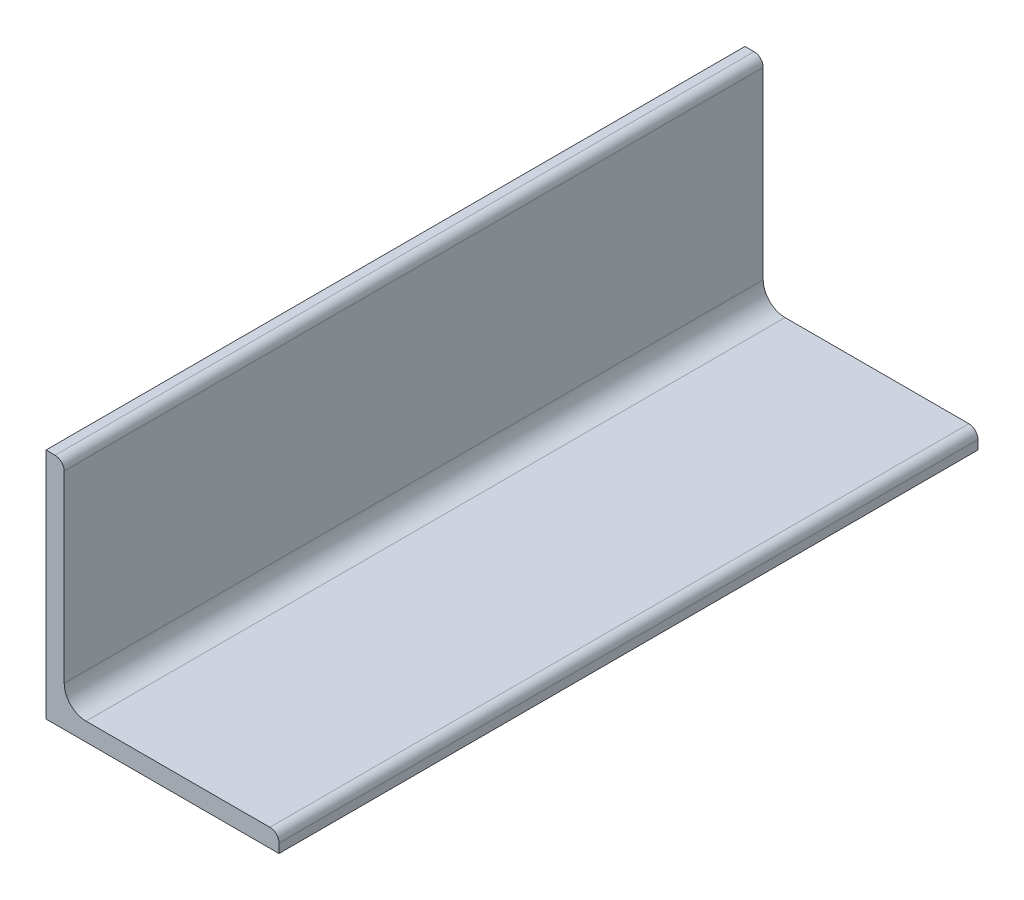
ISO-10303-21;
HEADER;
FILE_DESCRIPTION(('STEP AP214'),'2;1');
FILE_NAME('part.step','',(''),(''),'','','');
FILE_SCHEMA(('AUTOMOTIVE_DESIGN { 1 0 10303 214 1 1 1 1 }'));
ENDSEC;
DATA;
#1=APPLICATION_CONTEXT('core data for automotive mechanical design processes');
#2=APPLICATION_PROTOCOL_DEFINITION('international standard','automotive_design',2000,#1);
#3=PRODUCT_CONTEXT('',#1,'mechanical');
#4=PRODUCT('Part','Part','',(#3));
#5=PRODUCT_RELATED_PRODUCT_CATEGORY('part','',(#4));
#6=PRODUCT_DEFINITION_FORMATION('','',#4);
#7=PRODUCT_DEFINITION_CONTEXT('part definition',#1,'design');
#8=PRODUCT_DEFINITION('design','',#6,#7);
#9=PRODUCT_DEFINITION_SHAPE('','',#8);
#10=(LENGTH_UNIT() NAMED_UNIT(*) SI_UNIT(.MILLI.,.METRE.));
#11=(NAMED_UNIT(*) PLANE_ANGLE_UNIT() SI_UNIT($,.RADIAN.));
#12=(NAMED_UNIT(*) SI_UNIT($,.STERADIAN.) SOLID_ANGLE_UNIT());
#13=UNCERTAINTY_MEASURE_WITH_UNIT(LENGTH_MEASURE(1.E-05),#10,'distance_accuracy_value','');
#14=(GEOMETRIC_REPRESENTATION_CONTEXT(3) GLOBAL_UNCERTAINTY_ASSIGNED_CONTEXT((#13)) GLOBAL_UNIT_ASSIGNED_CONTEXT((#10,
#11,#12)) REPRESENTATION_CONTEXT('',''));
#15=CARTESIAN_POINT('',(0.,0.,0.));
#16=DIRECTION('',(0.,0.,1.));
#17=DIRECTION('',(1.,0.,0.));
#18=AXIS2_PLACEMENT_3D('',#15,#16,#17);
#19=CARTESIAN_POINT('',(0.865045893659089,102.172018782971,304.8));
#20=DIRECTION('',(1.,0.,0.));
#21=DIRECTION('',(0.,0.,-1.));
#22=AXIS2_PLACEMENT_3D('',#19,#20,#21);
#23=PLANE('',#22);
#24=DIRECTION('',(0.,-1.,0.));
#25=VECTOR('',#24,1.);
#26=CARTESIAN_POINT('',(0.865045893659089,102.172018782971,0.));
#27=LINE('',#26,#25);
#28=CARTESIAN_POINT('',(0.865045893659089,102.172018782971,0.));
#29=VERTEX_POINT('',#28);
#30=CARTESIAN_POINT('',(0.865045893659089,0.572018782971054,0.));
#31=VERTEX_POINT('',#30);
#32=EDGE_CURVE('E135',#29,#31,#27,.T.);
#33=ORIENTED_EDGE('',*,*,#32,.T.);
#34=DIRECTION('',(0.,0.,-1.));
#35=VECTOR('',#34,1.);
#36=CARTESIAN_POINT('',(0.865045893659089,0.572018782971054,304.8));
#37=LINE('',#36,#35);
#38=CARTESIAN_POINT('',(0.865045893659089,0.572018782971054,304.8));
#39=VERTEX_POINT('',#38);
#40=EDGE_CURVE('E11',#39,#31,#37,.T.);
#41=ORIENTED_EDGE('',*,*,#40,.F.);
#42=DIRECTION('',(0.,-1.,0.));
#43=VECTOR('',#42,1.);
#44=CARTESIAN_POINT('',(0.865045893659089,102.172018782971,304.8));
#45=LINE('',#44,#43);
#46=CARTESIAN_POINT('',(0.865045893659089,102.172018782971,304.8));
#47=VERTEX_POINT('',#46);
#48=EDGE_CURVE('E151',#47,#39,#45,.T.);
#49=ORIENTED_EDGE('',*,*,#48,.F.);
#50=DIRECTION('',(0.,0.,-1.));
#51=VECTOR('',#50,1.);
#52=CARTESIAN_POINT('',(0.865045893659089,102.172018782971,304.8));
#53=LINE('',#52,#51);
#54=EDGE_CURVE('E131',#47,#29,#53,.T.);
#55=ORIENTED_EDGE('',*,*,#54,.T.);
#56=EDGE_LOOP('',(#33,#41,#49,#55));
#57=FACE_BOUND('',#56,.T.);
#58=ADVANCED_FACE('F33',(#57),#23,.F.);
#59=CARTESIAN_POINT('',(0.865045893659089,0.572018782971054,304.8));
#60=DIRECTION('',(0.,1.,0.));
#61=DIRECTION('',(0.,0.,1.));
#62=AXIS2_PLACEMENT_3D('',#59,#60,#61);
#63=PLANE('',#62);
#64=DIRECTION('',(1.,0.,0.));
#65=VECTOR('',#64,1.);
#66=CARTESIAN_POINT('',(0.865045893659089,0.572018782971054,0.));
#67=LINE('',#66,#65);
#68=CARTESIAN_POINT('',(102.465045893659,0.572018782971054,0.));
#69=VERTEX_POINT('',#68);
#70=EDGE_CURVE('E138',#31,#69,#67,.T.);
#71=ORIENTED_EDGE('',*,*,#70,.T.);
#72=DIRECTION('',(0.,0.,-1.));
#73=VECTOR('',#72,1.);
#74=CARTESIAN_POINT('',(102.465045893659,0.572018782971054,304.8));
#75=LINE('',#74,#73);
#76=CARTESIAN_POINT('',(102.465045893659,0.572018782971054,304.8));
#77=VERTEX_POINT('',#76);
#78=EDGE_CURVE('E41',#77,#69,#75,.T.);
#79=ORIENTED_EDGE('',*,*,#78,.F.);
#80=DIRECTION('',(1.,0.,0.));
#81=VECTOR('',#80,1.);
#82=CARTESIAN_POINT('',(0.865045893659089,0.572018782971054,304.8));
#83=LINE('',#82,#81);
#84=EDGE_CURVE('E95',#39,#77,#83,.T.);
#85=ORIENTED_EDGE('',*,*,#84,.F.);
#86=ORIENTED_EDGE('',*,*,#40,.T.);
#87=EDGE_LOOP('',(#71,#79,#85,#86));
#88=FACE_BOUND('',#87,.T.);
#89=ADVANCED_FACE('F194',(#88),#63,.F.);
#90=CARTESIAN_POINT('',(102.465045893659,0.572018782971054,304.8));
#91=DIRECTION('',(-1.,0.,0.));
#92=DIRECTION('',(0.,0.,1.));
#93=AXIS2_PLACEMENT_3D('',#90,#91,#92);
#94=PLANE('',#93);
#95=DIRECTION('',(0.,1.,0.));
#96=VECTOR('',#95,1.);
#97=CARTESIAN_POINT('',(102.465045893659,0.572018782971054,0.));
#98=LINE('',#97,#96);
#99=CARTESIAN_POINT('',(102.465045893659,4.54076878297105,0.));
#100=VERTEX_POINT('',#99);
#101=EDGE_CURVE('E140',#69,#100,#98,.T.);
#102=ORIENTED_EDGE('',*,*,#101,.T.);
#103=DIRECTION('',(0.,0.,-1.));
#104=VECTOR('',#103,1.);
#105=CARTESIAN_POINT('',(102.465045893659,4.54076878297105,304.8));
#106=LINE('',#105,#104);
#107=CARTESIAN_POINT('',(102.465045893659,4.54076878297105,304.8));
#108=VERTEX_POINT('',#107);
#109=EDGE_CURVE('E161',#108,#100,#106,.T.);
#110=ORIENTED_EDGE('',*,*,#109,.F.);
#111=DIRECTION('',(0.,1.,0.));
#112=VECTOR('',#111,1.);
#113=CARTESIAN_POINT('',(102.465045893659,0.572018782971054,304.8));
#114=LINE('',#113,#112);
#115=EDGE_CURVE('E169',#77,#108,#114,.T.);
#116=ORIENTED_EDGE('',*,*,#115,.F.);
#117=ORIENTED_EDGE('',*,*,#78,.T.);
#118=EDGE_LOOP('',(#102,#110,#116,#117));
#119=FACE_BOUND('',#118,.T.);
#120=ADVANCED_FACE('F167',(#119),#94,.F.);
#121=CARTESIAN_POINT('',(98.4962958936591,4.54076878297105,304.8));
#122=DIRECTION('',(0.,0.,-1.));
#123=DIRECTION('',(-1.,0.,0.));
#124=AXIS2_PLACEMENT_3D('',#121,#122,#123);
#125=CYLINDRICAL_SURFACE('',#124,3.96875);
#126=CARTESIAN_POINT('',(98.4962958936591,4.54076878297105,0.));
#127=DIRECTION('',(0.,0.,1.));
#128=DIRECTION('',(1.,0.,0.));
#129=AXIS2_PLACEMENT_3D('',#126,#127,#128);
#130=CIRCLE('',#129,3.96875);
#131=CARTESIAN_POINT('',(98.4962958936591,8.50951878297106,0.));
#132=VERTEX_POINT('',#131);
#133=EDGE_CURVE('E142',#100,#132,#130,.T.);
#134=ORIENTED_EDGE('',*,*,#133,.T.);
#135=DIRECTION('',(0.,0.,-1.));
#136=VECTOR('',#135,1.);
#137=CARTESIAN_POINT('',(98.4962958936591,8.50951878297106,304.8));
#138=LINE('',#137,#136);
#139=CARTESIAN_POINT('',(98.4962958936591,8.50951878297106,304.8));
#140=VERTEX_POINT('',#139);
#141=EDGE_CURVE('E158',#140,#132,#138,.T.);
#142=ORIENTED_EDGE('',*,*,#141,.F.);
#143=CARTESIAN_POINT('',(98.4962958936591,4.54076878297105,304.8));
#144=DIRECTION('',(0.,0.,1.));
#145=DIRECTION('',(1.,0.,0.));
#146=AXIS2_PLACEMENT_3D('',#143,#144,#145);
#147=CIRCLE('',#146,3.96875);
#148=EDGE_CURVE('E185',#108,#140,#147,.T.);
#149=ORIENTED_EDGE('',*,*,#148,.F.);
#150=ORIENTED_EDGE('',*,*,#109,.T.);
#151=EDGE_LOOP('',(#134,#142,#149,#150));
#152=FACE_BOUND('',#151,.T.);
#153=ADVANCED_FACE('F178',(#152),#125,.T.);
#154=CARTESIAN_POINT('',(98.4962958936591,8.50951878297105,304.8));
#155=DIRECTION('',(0.,-1.,0.));
#156=DIRECTION('',(0.,0.,-1.));
#157=AXIS2_PLACEMENT_3D('',#154,#155,#156);
#158=PLANE('',#157);
#159=DIRECTION('',(-1.,0.,0.));
#160=VECTOR('',#159,1.);
#161=CARTESIAN_POINT('',(98.4962958936591,8.50951878297105,0.));
#162=LINE('',#161,#160);
#163=CARTESIAN_POINT('',(18.3275458936591,8.50951878297105,0.));
#164=VERTEX_POINT('',#163);
#165=EDGE_CURVE('E144',#132,#164,#162,.T.);
#166=ORIENTED_EDGE('',*,*,#165,.T.);
#167=DIRECTION('',(0.,0.,-1.));
#168=VECTOR('',#167,1.);
#169=CARTESIAN_POINT('',(18.3275458936591,8.50951878297105,304.8));
#170=LINE('',#169,#168);
#171=CARTESIAN_POINT('',(18.3275458936591,8.50951878297105,304.8));
#172=VERTEX_POINT('',#171);
#173=EDGE_CURVE('E155',#172,#164,#170,.T.);
#174=ORIENTED_EDGE('',*,*,#173,.F.);
#175=DIRECTION('',(-1.,0.,0.));
#176=VECTOR('',#175,1.);
#177=CARTESIAN_POINT('',(98.4962958936591,8.50951878297105,304.8));
#178=LINE('',#177,#176);
#179=EDGE_CURVE('E184',#140,#172,#178,.T.);
#180=ORIENTED_EDGE('',*,*,#179,.F.);
#181=ORIENTED_EDGE('',*,*,#141,.T.);
#182=EDGE_LOOP('',(#166,#174,#180,#181));
#183=FACE_BOUND('',#182,.T.);
#184=ADVANCED_FACE('F182',(#183),#158,.F.);
#185=CARTESIAN_POINT('',(18.3275458936591,18.034518782971,304.8));
#186=DIRECTION('',(0.,0.,-1.));
#187=DIRECTION('',(-1.,0.,0.));
#188=AXIS2_PLACEMENT_3D('',#185,#186,#187);
#189=CYLINDRICAL_SURFACE('',#188,9.52499999999999);
#190=CARTESIAN_POINT('',(18.3275458936591,18.034518782971,0.));
#191=DIRECTION('',(0.,0.,-1.));
#192=DIRECTION('',(1.,0.,0.));
#193=AXIS2_PLACEMENT_3D('',#190,#191,#192);
#194=CIRCLE('',#193,9.52499999999999);
#195=CARTESIAN_POINT('',(8.80254589365909,18.0345187829711,0.));
#196=VERTEX_POINT('',#195);
#197=EDGE_CURVE('E146',#164,#196,#194,.T.);
#198=ORIENTED_EDGE('',*,*,#197,.T.);
#199=DIRECTION('',(0.,0.,-1.));
#200=VECTOR('',#199,1.);
#201=CARTESIAN_POINT('',(8.80254589365909,18.0345187829711,304.8));
#202=LINE('',#201,#200);
#203=CARTESIAN_POINT('',(8.80254589365909,18.0345187829711,304.8));
#204=VERTEX_POINT('',#203);
#205=EDGE_CURVE('E126',#204,#196,#202,.T.);
#206=ORIENTED_EDGE('',*,*,#205,.F.);
#207=CARTESIAN_POINT('',(18.3275458936591,18.034518782971,304.8));
#208=DIRECTION('',(0.,0.,-1.));
#209=DIRECTION('',(1.,0.,0.));
#210=AXIS2_PLACEMENT_3D('',#207,#208,#209);
#211=CIRCLE('',#210,9.52499999999999);
#212=EDGE_CURVE('E117',#172,#204,#211,.T.);
#213=ORIENTED_EDGE('',*,*,#212,.F.);
#214=ORIENTED_EDGE('',*,*,#173,.T.);
#215=EDGE_LOOP('',(#198,#206,#213,#214));
#216=FACE_BOUND('',#215,.T.);
#217=ADVANCED_FACE('F206',(#216),#189,.F.);
#218=CARTESIAN_POINT('',(8.80254589365909,18.0345187829711,304.8));
#219=DIRECTION('',(-1.,0.,0.));
#220=DIRECTION('',(0.,0.,1.));
#221=AXIS2_PLACEMENT_3D('',#218,#219,#220);
#222=PLANE('',#221);
#223=DIRECTION('',(0.,1.,0.));
#224=VECTOR('',#223,1.);
#225=CARTESIAN_POINT('',(8.80254589365909,18.0345187829711,0.));
#226=LINE('',#225,#224);
#227=CARTESIAN_POINT('',(8.80254589365909,98.2032687829711,0.));
#228=VERTEX_POINT('',#227);
#229=EDGE_CURVE('E125',#196,#228,#226,.T.);
#230=ORIENTED_EDGE('',*,*,#229,.T.);
#231=DIRECTION('',(0.,0.,-1.));
#232=VECTOR('',#231,1.);
#233=CARTESIAN_POINT('',(8.80254589365909,98.2032687829711,304.8));
#234=LINE('',#233,#232);
#235=CARTESIAN_POINT('',(8.80254589365909,98.2032687829711,304.8));
#236=VERTEX_POINT('',#235);
#237=EDGE_CURVE('E122',#236,#228,#234,.T.);
#238=ORIENTED_EDGE('',*,*,#237,.F.);
#239=DIRECTION('',(0.,1.,0.));
#240=VECTOR('',#239,1.);
#241=CARTESIAN_POINT('',(8.80254589365909,18.0345187829711,304.8));
#242=LINE('',#241,#240);
#243=EDGE_CURVE('E111',#204,#236,#242,.T.);
#244=ORIENTED_EDGE('',*,*,#243,.F.);
#245=ORIENTED_EDGE('',*,*,#205,.T.);
#246=EDGE_LOOP('',(#230,#238,#244,#245));
#247=FACE_BOUND('',#246,.T.);
#248=ADVANCED_FACE('F123',(#247),#222,.F.);
#249=CARTESIAN_POINT('',(4.83379589365909,98.203268782971,304.8));
#250=DIRECTION('',(0.,0.,-1.));
#251=DIRECTION('',(-1.,0.,0.));
#252=AXIS2_PLACEMENT_3D('',#249,#250,#251);
#253=CYLINDRICAL_SURFACE('',#252,3.96875);
#254=CARTESIAN_POINT('',(4.83379589365909,98.203268782971,0.));
#255=DIRECTION('',(0.,0.,1.));
#256=DIRECTION('',(1.,0.,0.));
#257=AXIS2_PLACEMENT_3D('',#254,#255,#256);
#258=CIRCLE('',#257,3.96875);
#259=CARTESIAN_POINT('',(4.83379589365909,102.172018782971,0.));
#260=VERTEX_POINT('',#259);
#261=EDGE_CURVE('E81',#228,#260,#258,.T.);
#262=ORIENTED_EDGE('',*,*,#261,.T.);
#263=DIRECTION('',(0.,0.,-1.));
#264=VECTOR('',#263,1.);
#265=CARTESIAN_POINT('',(4.83379589365909,102.172018782971,304.8));
#266=LINE('',#265,#264);
#267=CARTESIAN_POINT('',(4.83379589365909,102.172018782971,304.8));
#268=VERTEX_POINT('',#267);
#269=EDGE_CURVE('E127',#268,#260,#266,.T.);
#270=ORIENTED_EDGE('',*,*,#269,.F.);
#271=CARTESIAN_POINT('',(4.83379589365909,98.203268782971,304.8));
#272=DIRECTION('',(0.,0.,1.));
#273=DIRECTION('',(1.,0.,0.));
#274=AXIS2_PLACEMENT_3D('',#271,#272,#273);
#275=CIRCLE('',#274,3.96875);
#276=EDGE_CURVE('E115',#236,#268,#275,.T.);
#277=ORIENTED_EDGE('',*,*,#276,.F.);
#278=ORIENTED_EDGE('',*,*,#237,.T.);
#279=EDGE_LOOP('',(#262,#270,#277,#278));
#280=FACE_BOUND('',#279,.T.);
#281=ADVANCED_FACE('F129',(#280),#253,.T.);
#282=CARTESIAN_POINT('',(4.83379589365909,102.172018782971,304.8));
#283=DIRECTION('',(0.,-1.,0.));
#284=DIRECTION('',(0.,0.,-1.));
#285=AXIS2_PLACEMENT_3D('',#282,#283,#284);
#286=PLANE('',#285);
#287=DIRECTION('',(-1.,0.,0.));
#288=VECTOR('',#287,1.);
#289=CARTESIAN_POINT('',(4.83379589365909,102.172018782971,0.));
#290=LINE('',#289,#288);
#291=EDGE_CURVE('E87',#260,#29,#290,.T.);
#292=ORIENTED_EDGE('',*,*,#291,.T.);
#293=ORIENTED_EDGE('',*,*,#54,.F.);
#294=DIRECTION('',(-1.,0.,0.));
#295=VECTOR('',#294,1.);
#296=CARTESIAN_POINT('',(4.83379589365909,102.172018782971,304.8));
#297=LINE('',#296,#295);
#298=EDGE_CURVE('E49',#268,#47,#297,.T.);
#299=ORIENTED_EDGE('',*,*,#298,.F.);
#300=ORIENTED_EDGE('',*,*,#269,.T.);
#301=EDGE_LOOP('',(#292,#293,#299,#300));
#302=FACE_BOUND('',#301,.T.);
#303=ADVANCED_FACE('F214',(#302),#286,.F.);
#304=CARTESIAN_POINT('',(98.4962958936591,4.54076878297105,304.8));
#305=DIRECTION('',(0.,0.,1.));
#306=DIRECTION('',(1.,0.,0.));
#307=AXIS2_PLACEMENT_3D('',#304,#305,#306);
#308=PLANE('',#307);
#309=ORIENTED_EDGE('',*,*,#48,.T.);
#310=ORIENTED_EDGE('',*,*,#84,.T.);
#311=ORIENTED_EDGE('',*,*,#115,.T.);
#312=ORIENTED_EDGE('',*,*,#148,.T.);
#313=ORIENTED_EDGE('',*,*,#179,.T.);
#314=ORIENTED_EDGE('',*,*,#212,.T.);
#315=ORIENTED_EDGE('',*,*,#243,.T.);
#316=ORIENTED_EDGE('',*,*,#276,.T.);
#317=ORIENTED_EDGE('',*,*,#298,.T.);
#318=EDGE_LOOP('',(#309,#310,#311,#312,#313,#314,#315,#316,#317));
#319=FACE_BOUND('',#318,.T.);
#320=ADVANCED_FACE('F113',(#319),#308,.T.);
#321=CARTESIAN_POINT('',(98.4962958936591,4.54076878297105,0.));
#322=DIRECTION('',(0.,0.,1.));
#323=DIRECTION('',(1.,0.,0.));
#324=AXIS2_PLACEMENT_3D('',#321,#322,#323);
#325=PLANE('',#324);
#326=ORIENTED_EDGE('',*,*,#32,.F.);
#327=ORIENTED_EDGE('',*,*,#291,.F.);
#328=ORIENTED_EDGE('',*,*,#261,.F.);
#329=ORIENTED_EDGE('',*,*,#229,.F.);
#330=ORIENTED_EDGE('',*,*,#197,.F.);
#331=ORIENTED_EDGE('',*,*,#165,.F.);
#332=ORIENTED_EDGE('',*,*,#133,.F.);
#333=ORIENTED_EDGE('',*,*,#101,.F.);
#334=ORIENTED_EDGE('',*,*,#70,.F.);
#335=EDGE_LOOP('',(#326,#327,#328,#329,#330,#331,#332,#333,#334));
#336=FACE_BOUND('',#335,.T.);
#337=ADVANCED_FACE('F173',(#336),#325,.F.);
#338=CLOSED_SHELL('',(#58,#89,#120,#153,#184,#217,#248,#281,#303,#320,#337));
#339=MANIFOLD_SOLID_BREP('B2',#338);
#340=ADVANCED_BREP_SHAPE_REPRESENTATION('',(#18,#339),#14);
#341=SHAPE_DEFINITION_REPRESENTATION(#9,#340);
ENDSEC;
END-ISO-10303-21;
